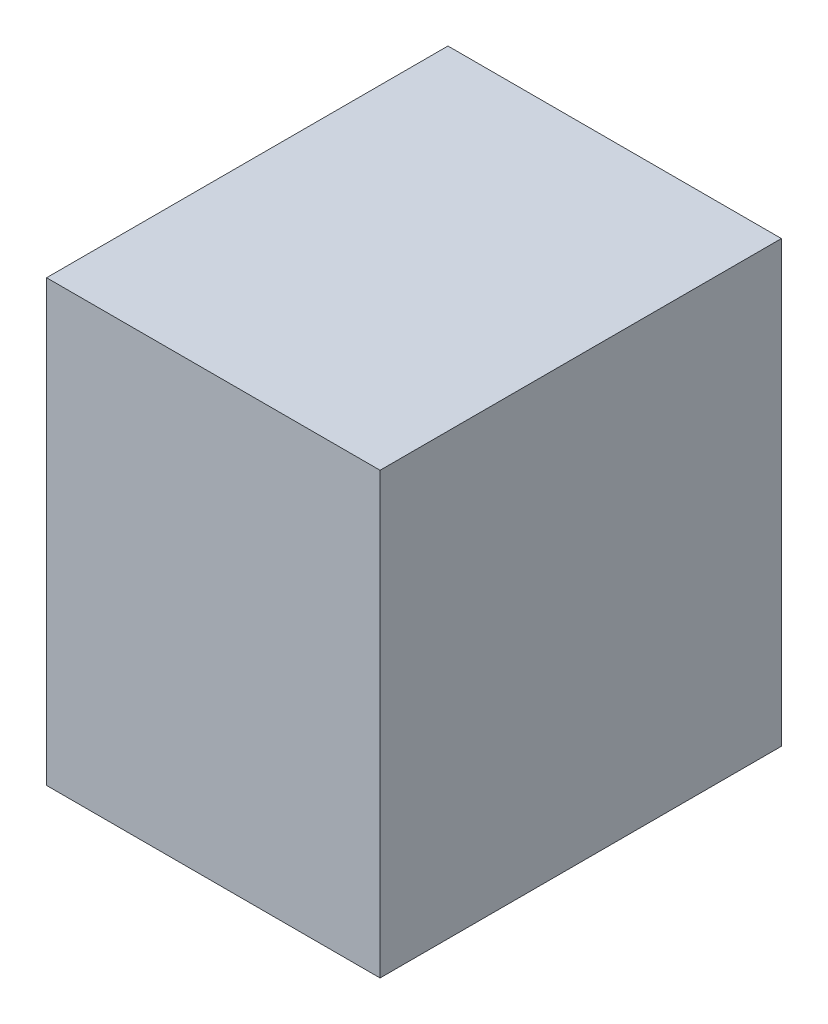
ISO-10303-21;
HEADER;
FILE_DESCRIPTION(('STEP AP214'),'2;1');
FILE_NAME('part.step','',(''),(''),'','','');
FILE_SCHEMA(('AUTOMOTIVE_DESIGN { 1 0 10303 214 1 1 1 1 }'));
ENDSEC;
DATA;
#1=APPLICATION_CONTEXT('core data for automotive mechanical design processes');
#2=APPLICATION_PROTOCOL_DEFINITION('international standard','automotive_design',2000,#1);
#3=PRODUCT_CONTEXT('',#1,'mechanical');
#4=PRODUCT('Part','Part','',(#3));
#5=PRODUCT_RELATED_PRODUCT_CATEGORY('part','',(#4));
#6=PRODUCT_DEFINITION_FORMATION('','',#4);
#7=PRODUCT_DEFINITION_CONTEXT('part definition',#1,'design');
#8=PRODUCT_DEFINITION('design','',#6,#7);
#9=PRODUCT_DEFINITION_SHAPE('','',#8);
#10=(LENGTH_UNIT() NAMED_UNIT(*) SI_UNIT(.MILLI.,.METRE.));
#11=(NAMED_UNIT(*) PLANE_ANGLE_UNIT() SI_UNIT($,.RADIAN.));
#12=(NAMED_UNIT(*) SI_UNIT($,.STERADIAN.) SOLID_ANGLE_UNIT());
#13=UNCERTAINTY_MEASURE_WITH_UNIT(LENGTH_MEASURE(1.E-05),#10,'distance_accuracy_value','');
#14=(GEOMETRIC_REPRESENTATION_CONTEXT(3) GLOBAL_UNCERTAINTY_ASSIGNED_CONTEXT((#13)) GLOBAL_UNIT_ASSIGNED_CONTEXT((#10,
#11,#12)) REPRESENTATION_CONTEXT('',''));
#15=CARTESIAN_POINT('',(0.,0.,0.));
#16=DIRECTION('',(0.,0.,1.));
#17=DIRECTION('',(1.,0.,0.));
#18=AXIS2_PLACEMENT_3D('',#15,#16,#17);
#19=CARTESIAN_POINT('',(56.5,74.5,-68.));
#20=DIRECTION('',(-1.,0.,0.));
#21=DIRECTION('',(0.,0.,1.));
#22=AXIS2_PLACEMENT_3D('',#19,#20,#21);
#23=PLANE('',#22);
#24=DIRECTION('',(0.,0.,-1.));
#25=VECTOR('',#24,1.);
#26=CARTESIAN_POINT('',(56.5,-74.5,-68.));
#27=LINE('',#26,#25);
#28=CARTESIAN_POINT('',(56.5,-74.5,68.));
#29=VERTEX_POINT('',#28);
#30=CARTESIAN_POINT('',(56.5,-74.5,-68.));
#31=VERTEX_POINT('',#30);
#32=EDGE_CURVE('E100',#29,#31,#27,.T.);
#33=ORIENTED_EDGE('',*,*,#32,.T.);
#34=DIRECTION('',(0.,-1.,0.));
#35=VECTOR('',#34,1.);
#36=CARTESIAN_POINT('',(56.5,74.5,-68.));
#37=LINE('',#36,#35);
#38=CARTESIAN_POINT('',(56.5,74.5,-68.));
#39=VERTEX_POINT('',#38);
#40=EDGE_CURVE('E11',#39,#31,#37,.T.);
#41=ORIENTED_EDGE('',*,*,#40,.F.);
#42=DIRECTION('',(0.,0.,-1.));
#43=VECTOR('',#42,1.);
#44=CARTESIAN_POINT('',(56.5,74.5,-68.));
#45=LINE('',#44,#43);
#46=CARTESIAN_POINT('',(56.5,74.5,68.));
#47=VERTEX_POINT('',#46);
#48=EDGE_CURVE('E88',#47,#39,#45,.T.);
#49=ORIENTED_EDGE('',*,*,#48,.F.);
#50=DIRECTION('',(0.,-1.,0.));
#51=VECTOR('',#50,1.);
#52=CARTESIAN_POINT('',(56.5,74.5,68.));
#53=LINE('',#52,#51);
#54=EDGE_CURVE('E96',#47,#29,#53,.T.);
#55=ORIENTED_EDGE('',*,*,#54,.T.);
#56=EDGE_LOOP('',(#33,#41,#49,#55));
#57=FACE_BOUND('',#56,.T.);
#58=ADVANCED_FACE('F37',(#57),#23,.F.);
#59=CARTESIAN_POINT('',(-56.5,74.5,-68.));
#60=DIRECTION('',(0.,0.,1.));
#61=DIRECTION('',(1.,0.,0.));
#62=AXIS2_PLACEMENT_3D('',#59,#60,#61);
#63=PLANE('',#62);
#64=DIRECTION('',(-1.,0.,0.));
#65=VECTOR('',#64,1.);
#66=CARTESIAN_POINT('',(-56.5,-74.5,-68.));
#67=LINE('',#66,#65);
#68=CARTESIAN_POINT('',(-56.5,-74.5,-68.));
#69=VERTEX_POINT('',#68);
#70=EDGE_CURVE('E92',#31,#69,#67,.T.);
#71=ORIENTED_EDGE('',*,*,#70,.T.);
#72=DIRECTION('',(0.,-1.,0.));
#73=VECTOR('',#72,1.);
#74=CARTESIAN_POINT('',(-56.5,74.5,-68.));
#75=LINE('',#74,#73);
#76=CARTESIAN_POINT('',(-56.5,74.5,-68.));
#77=VERTEX_POINT('',#76);
#78=EDGE_CURVE('E45',#77,#69,#75,.T.);
#79=ORIENTED_EDGE('',*,*,#78,.F.);
#80=DIRECTION('',(-1.,0.,0.));
#81=VECTOR('',#80,1.);
#82=CARTESIAN_POINT('',(-56.5,74.5,-68.));
#83=LINE('',#82,#81);
#84=EDGE_CURVE('E83',#39,#77,#83,.T.);
#85=ORIENTED_EDGE('',*,*,#84,.F.);
#86=ORIENTED_EDGE('',*,*,#40,.T.);
#87=EDGE_LOOP('',(#71,#79,#85,#86));
#88=FACE_BOUND('',#87,.T.);
#89=ADVANCED_FACE('F91',(#88),#63,.F.);
#90=CARTESIAN_POINT('',(-56.5,74.5,-68.));
#91=DIRECTION('',(1.,0.,0.));
#92=DIRECTION('',(0.,0.,-1.));
#93=AXIS2_PLACEMENT_3D('',#90,#91,#92);
#94=PLANE('',#93);
#95=DIRECTION('',(0.,0.,1.));
#96=VECTOR('',#95,1.);
#97=CARTESIAN_POINT('',(-56.5,-74.5,-68.));
#98=LINE('',#97,#96);
#99=CARTESIAN_POINT('',(-56.5,-74.5,68.));
#100=VERTEX_POINT('',#99);
#101=EDGE_CURVE('E70',#69,#100,#98,.T.);
#102=ORIENTED_EDGE('',*,*,#101,.T.);
#103=DIRECTION('',(0.,-1.,0.));
#104=VECTOR('',#103,1.);
#105=CARTESIAN_POINT('',(-56.5,74.5,68.));
#106=LINE('',#105,#104);
#107=CARTESIAN_POINT('',(-56.5,74.5,68.));
#108=VERTEX_POINT('',#107);
#109=EDGE_CURVE('E93',#108,#100,#106,.T.);
#110=ORIENTED_EDGE('',*,*,#109,.F.);
#111=DIRECTION('',(0.,0.,1.));
#112=VECTOR('',#111,1.);
#113=CARTESIAN_POINT('',(-56.5,74.5,-68.));
#114=LINE('',#113,#112);
#115=EDGE_CURVE('E86',#77,#108,#114,.T.);
#116=ORIENTED_EDGE('',*,*,#115,.F.);
#117=ORIENTED_EDGE('',*,*,#78,.T.);
#118=EDGE_LOOP('',(#102,#110,#116,#117));
#119=FACE_BOUND('',#118,.T.);
#120=ADVANCED_FACE('F94',(#119),#94,.F.);
#121=CARTESIAN_POINT('',(-56.5,74.5,68.));
#122=DIRECTION('',(0.,0.,-1.));
#123=DIRECTION('',(-1.,0.,0.));
#124=AXIS2_PLACEMENT_3D('',#121,#122,#123);
#125=PLANE('',#124);
#126=DIRECTION('',(1.,0.,0.));
#127=VECTOR('',#126,1.);
#128=CARTESIAN_POINT('',(-56.5,-74.5,68.));
#129=LINE('',#128,#127);
#130=EDGE_CURVE('E76',#100,#29,#129,.T.);
#131=ORIENTED_EDGE('',*,*,#130,.T.);
#132=ORIENTED_EDGE('',*,*,#54,.F.);
#133=DIRECTION('',(1.,0.,0.));
#134=VECTOR('',#133,1.);
#135=CARTESIAN_POINT('',(-56.5,74.5,68.));
#136=LINE('',#135,#134);
#137=EDGE_CURVE('E53',#108,#47,#136,.T.);
#138=ORIENTED_EDGE('',*,*,#137,.F.);
#139=ORIENTED_EDGE('',*,*,#109,.T.);
#140=EDGE_LOOP('',(#131,#132,#138,#139));
#141=FACE_BOUND('',#140,.T.);
#142=ADVANCED_FACE('F107',(#141),#125,.F.);
#143=CARTESIAN_POINT('',(0.,74.5,0.));
#144=DIRECTION('',(0.,1.,0.));
#145=DIRECTION('',(0.,0.,1.));
#146=AXIS2_PLACEMENT_3D('',#143,#144,#145);
#147=PLANE('',#146);
#148=ORIENTED_EDGE('',*,*,#48,.T.);
#149=ORIENTED_EDGE('',*,*,#84,.T.);
#150=ORIENTED_EDGE('',*,*,#115,.T.);
#151=ORIENTED_EDGE('',*,*,#137,.T.);
#152=EDGE_LOOP('',(#148,#149,#150,#151));
#153=FACE_BOUND('',#152,.T.);
#154=ADVANCED_FACE('F84',(#153),#147,.T.);
#155=CARTESIAN_POINT('',(0.,-74.5,0.));
#156=DIRECTION('',(0.,1.,0.));
#157=DIRECTION('',(0.,0.,1.));
#158=AXIS2_PLACEMENT_3D('',#155,#156,#157);
#159=PLANE('',#158);
#160=ORIENTED_EDGE('',*,*,#32,.F.);
#161=ORIENTED_EDGE('',*,*,#130,.F.);
#162=ORIENTED_EDGE('',*,*,#101,.F.);
#163=ORIENTED_EDGE('',*,*,#70,.F.);
#164=EDGE_LOOP('',(#160,#161,#162,#163));
#165=FACE_BOUND('',#164,.T.);
#166=ADVANCED_FACE('F110',(#165),#159,.F.);
#167=CLOSED_SHELL('',(#58,#89,#120,#142,#154,#166));
#168=MANIFOLD_SOLID_BREP('B2',#167);
#169=ADVANCED_BREP_SHAPE_REPRESENTATION('',(#18,#168),#14);
#170=SHAPE_DEFINITION_REPRESENTATION(#9,#169);
ENDSEC;
END-ISO-10303-21;
